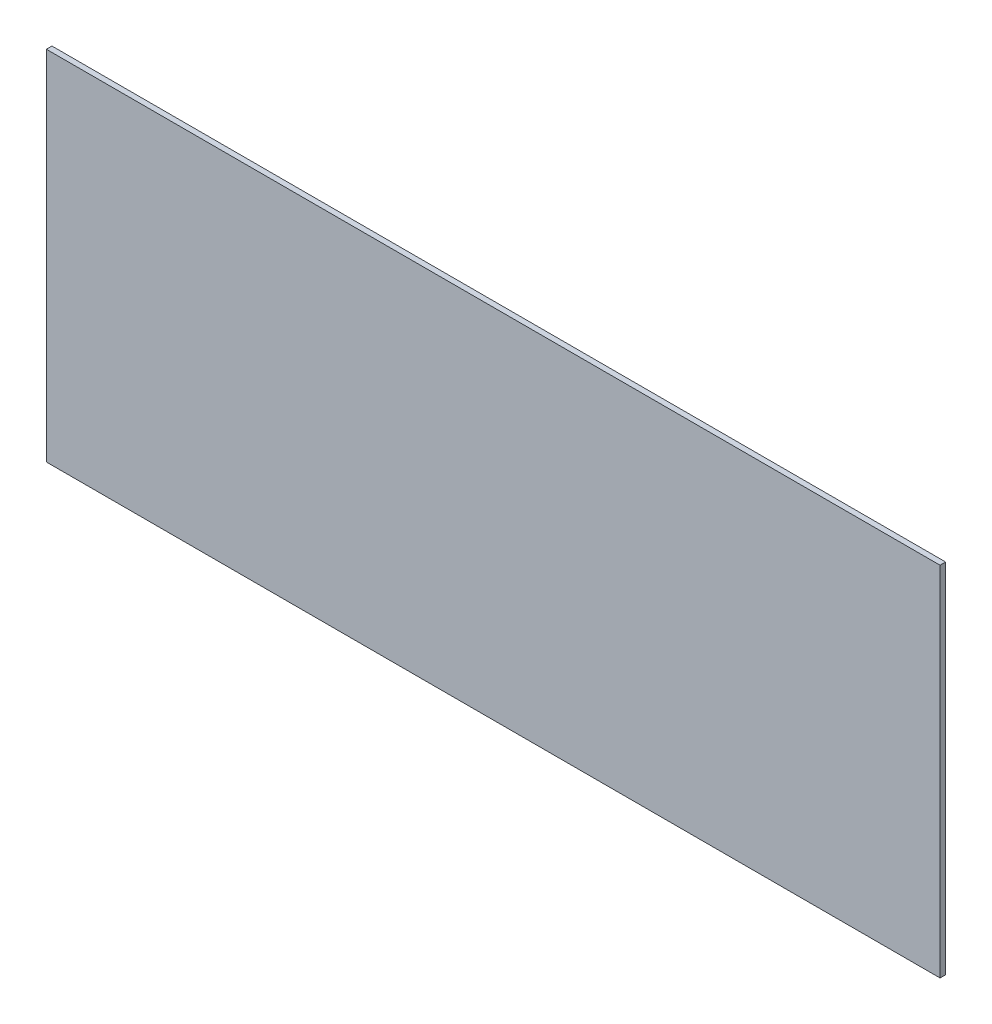
ISO-10303-21;
HEADER;
FILE_DESCRIPTION(('STEP AP214'),'2;1');
FILE_NAME('part.step','',(''),(''),'','','');
FILE_SCHEMA(('AUTOMOTIVE_DESIGN { 1 0 10303 214 1 1 1 1 }'));
ENDSEC;
DATA;
#1=APPLICATION_CONTEXT('core data for automotive mechanical design processes');
#2=APPLICATION_PROTOCOL_DEFINITION('international standard','automotive_design',2000,#1);
#3=PRODUCT_CONTEXT('',#1,'mechanical');
#4=PRODUCT('Part','Part','',(#3));
#5=PRODUCT_RELATED_PRODUCT_CATEGORY('part','',(#4));
#6=PRODUCT_DEFINITION_FORMATION('','',#4);
#7=PRODUCT_DEFINITION_CONTEXT('part definition',#1,'design');
#8=PRODUCT_DEFINITION('design','',#6,#7);
#9=PRODUCT_DEFINITION_SHAPE('','',#8);
#10=(LENGTH_UNIT() NAMED_UNIT(*) SI_UNIT(.MILLI.,.METRE.));
#11=(NAMED_UNIT(*) PLANE_ANGLE_UNIT() SI_UNIT($,.RADIAN.));
#12=(NAMED_UNIT(*) SI_UNIT($,.STERADIAN.) SOLID_ANGLE_UNIT());
#13=UNCERTAINTY_MEASURE_WITH_UNIT(LENGTH_MEASURE(1.E-05),#10,'distance_accuracy_value','');
#14=(GEOMETRIC_REPRESENTATION_CONTEXT(3) GLOBAL_UNCERTAINTY_ASSIGNED_CONTEXT((#13)) GLOBAL_UNIT_ASSIGNED_CONTEXT((#10,
#11,#12)) REPRESENTATION_CONTEXT('',''));
#15=CARTESIAN_POINT('',(0.,0.,0.));
#16=DIRECTION('',(0.,0.,1.));
#17=DIRECTION('',(1.,0.,0.));
#18=AXIS2_PLACEMENT_3D('',#15,#16,#17);
#19=CARTESIAN_POINT('',(63.5,25.4,0.79375));
#20=DIRECTION('',(-1.,0.,0.));
#21=DIRECTION('',(0.,-1.,0.));
#22=AXIS2_PLACEMENT_3D('',#19,#20,#21);
#23=PLANE('',#22);
#24=DIRECTION('',(0.,1.,0.));
#25=VECTOR('',#24,1.);
#26=CARTESIAN_POINT('',(63.5,25.4,0.));
#27=LINE('',#26,#25);
#28=CARTESIAN_POINT('',(63.5,-25.4,0.));
#29=VERTEX_POINT('',#28);
#30=CARTESIAN_POINT('',(63.5,25.4,0.));
#31=VERTEX_POINT('',#30);
#32=EDGE_CURVE('E97',#29,#31,#27,.T.);
#33=ORIENTED_EDGE('',*,*,#32,.T.);
#34=DIRECTION('',(0.,0.,-1.));
#35=VECTOR('',#34,1.);
#36=CARTESIAN_POINT('',(63.5,25.4,0.79375));
#37=LINE('',#36,#35);
#38=CARTESIAN_POINT('',(63.5,25.4,0.79375));
#39=VERTEX_POINT('',#38);
#40=EDGE_CURVE('E11',#39,#31,#37,.T.);
#41=ORIENTED_EDGE('',*,*,#40,.F.);
#42=DIRECTION('',(0.,1.,0.));
#43=VECTOR('',#42,1.);
#44=CARTESIAN_POINT('',(63.5,25.4,0.79375));
#45=LINE('',#44,#43);
#46=CARTESIAN_POINT('',(63.5,-25.4,0.79375));
#47=VERTEX_POINT('',#46);
#48=EDGE_CURVE('E85',#47,#39,#45,.T.);
#49=ORIENTED_EDGE('',*,*,#48,.F.);
#50=DIRECTION('',(0.,0.,-1.));
#51=VECTOR('',#50,1.);
#52=CARTESIAN_POINT('',(63.5,-25.4,0.79375));
#53=LINE('',#52,#51);
#54=EDGE_CURVE('E93',#47,#29,#53,.T.);
#55=ORIENTED_EDGE('',*,*,#54,.T.);
#56=EDGE_LOOP('',(#33,#41,#49,#55));
#57=FACE_BOUND('',#56,.T.);
#58=ADVANCED_FACE('F34',(#57),#23,.F.);
#59=CARTESIAN_POINT('',(-63.5,25.4,0.79375));
#60=DIRECTION('',(0.,-1.,0.));
#61=DIRECTION('',(0.,0.,-1.));
#62=AXIS2_PLACEMENT_3D('',#59,#60,#61);
#63=PLANE('',#62);
#64=DIRECTION('',(-1.,0.,0.));
#65=VECTOR('',#64,1.);
#66=CARTESIAN_POINT('',(-63.5,25.4,0.));
#67=LINE('',#66,#65);
#68=CARTESIAN_POINT('',(-63.5,25.4,0.));
#69=VERTEX_POINT('',#68);
#70=EDGE_CURVE('E89',#31,#69,#67,.T.);
#71=ORIENTED_EDGE('',*,*,#70,.T.);
#72=DIRECTION('',(0.,0.,-1.));
#73=VECTOR('',#72,1.);
#74=CARTESIAN_POINT('',(-63.5,25.4,0.79375));
#75=LINE('',#74,#73);
#76=CARTESIAN_POINT('',(-63.5,25.4,0.79375));
#77=VERTEX_POINT('',#76);
#78=EDGE_CURVE('E42',#77,#69,#75,.T.);
#79=ORIENTED_EDGE('',*,*,#78,.F.);
#80=DIRECTION('',(-1.,0.,0.));
#81=VECTOR('',#80,1.);
#82=CARTESIAN_POINT('',(-63.5,25.4,0.79375));
#83=LINE('',#82,#81);
#84=EDGE_CURVE('E80',#39,#77,#83,.T.);
#85=ORIENTED_EDGE('',*,*,#84,.F.);
#86=ORIENTED_EDGE('',*,*,#40,.T.);
#87=EDGE_LOOP('',(#71,#79,#85,#86));
#88=FACE_BOUND('',#87,.T.);
#89=ADVANCED_FACE('F88',(#88),#63,.F.);
#90=CARTESIAN_POINT('',(-63.5,25.4,0.79375));
#91=DIRECTION('',(1.,0.,0.));
#92=DIRECTION('',(0.,1.,0.));
#93=AXIS2_PLACEMENT_3D('',#90,#91,#92);
#94=PLANE('',#93);
#95=DIRECTION('',(0.,-1.,0.));
#96=VECTOR('',#95,1.);
#97=CARTESIAN_POINT('',(-63.5,25.4,0.));
#98=LINE('',#97,#96);
#99=CARTESIAN_POINT('',(-63.5,-25.4,0.));
#100=VERTEX_POINT('',#99);
#101=EDGE_CURVE('E67',#69,#100,#98,.T.);
#102=ORIENTED_EDGE('',*,*,#101,.T.);
#103=DIRECTION('',(0.,0.,-1.));
#104=VECTOR('',#103,1.);
#105=CARTESIAN_POINT('',(-63.5,-25.4,0.79375));
#106=LINE('',#105,#104);
#107=CARTESIAN_POINT('',(-63.5,-25.4,0.79375));
#108=VERTEX_POINT('',#107);
#109=EDGE_CURVE('E90',#108,#100,#106,.T.);
#110=ORIENTED_EDGE('',*,*,#109,.F.);
#111=DIRECTION('',(0.,-1.,0.));
#112=VECTOR('',#111,1.);
#113=CARTESIAN_POINT('',(-63.5,25.4,0.79375));
#114=LINE('',#113,#112);
#115=EDGE_CURVE('E83',#77,#108,#114,.T.);
#116=ORIENTED_EDGE('',*,*,#115,.F.);
#117=ORIENTED_EDGE('',*,*,#78,.T.);
#118=EDGE_LOOP('',(#102,#110,#116,#117));
#119=FACE_BOUND('',#118,.T.);
#120=ADVANCED_FACE('F91',(#119),#94,.F.);
#121=CARTESIAN_POINT('',(-63.5,-25.4,0.79375));
#122=DIRECTION('',(0.,1.,0.));
#123=DIRECTION('',(0.,0.,1.));
#124=AXIS2_PLACEMENT_3D('',#121,#122,#123);
#125=PLANE('',#124);
#126=DIRECTION('',(1.,0.,0.));
#127=VECTOR('',#126,1.);
#128=CARTESIAN_POINT('',(-63.5,-25.4,0.));
#129=LINE('',#128,#127);
#130=EDGE_CURVE('E73',#100,#29,#129,.T.);
#131=ORIENTED_EDGE('',*,*,#130,.T.);
#132=ORIENTED_EDGE('',*,*,#54,.F.);
#133=DIRECTION('',(1.,0.,0.));
#134=VECTOR('',#133,1.);
#135=CARTESIAN_POINT('',(-63.5,-25.4,0.79375));
#136=LINE('',#135,#134);
#137=EDGE_CURVE('E50',#108,#47,#136,.T.);
#138=ORIENTED_EDGE('',*,*,#137,.F.);
#139=ORIENTED_EDGE('',*,*,#109,.T.);
#140=EDGE_LOOP('',(#131,#132,#138,#139));
#141=FACE_BOUND('',#140,.T.);
#142=ADVANCED_FACE('F104',(#141),#125,.F.);
#143=CARTESIAN_POINT('',(0.,0.,0.79375));
#144=DIRECTION('',(0.,0.,1.));
#145=DIRECTION('',(1.,0.,0.));
#146=AXIS2_PLACEMENT_3D('',#143,#144,#145);
#147=PLANE('',#146);
#148=ORIENTED_EDGE('',*,*,#48,.T.);
#149=ORIENTED_EDGE('',*,*,#84,.T.);
#150=ORIENTED_EDGE('',*,*,#115,.T.);
#151=ORIENTED_EDGE('',*,*,#137,.T.);
#152=EDGE_LOOP('',(#148,#149,#150,#151));
#153=FACE_BOUND('',#152,.T.);
#154=ADVANCED_FACE('F81',(#153),#147,.T.);
#155=CARTESIAN_POINT('',(0.,0.,0.));
#156=DIRECTION('',(0.,0.,1.));
#157=DIRECTION('',(1.,0.,0.));
#158=AXIS2_PLACEMENT_3D('',#155,#156,#157);
#159=PLANE('',#158);
#160=ORIENTED_EDGE('',*,*,#32,.F.);
#161=ORIENTED_EDGE('',*,*,#130,.F.);
#162=ORIENTED_EDGE('',*,*,#101,.F.);
#163=ORIENTED_EDGE('',*,*,#70,.F.);
#164=EDGE_LOOP('',(#160,#161,#162,#163));
#165=FACE_BOUND('',#164,.T.);
#166=ADVANCED_FACE('F107',(#165),#159,.F.);
#167=CLOSED_SHELL('',(#58,#89,#120,#142,#154,#166));
#168=MANIFOLD_SOLID_BREP('B2',#167);
#169=ADVANCED_BREP_SHAPE_REPRESENTATION('',(#18,#168),#14);
#170=SHAPE_DEFINITION_REPRESENTATION(#9,#169);
ENDSEC;
END-ISO-10303-21;
